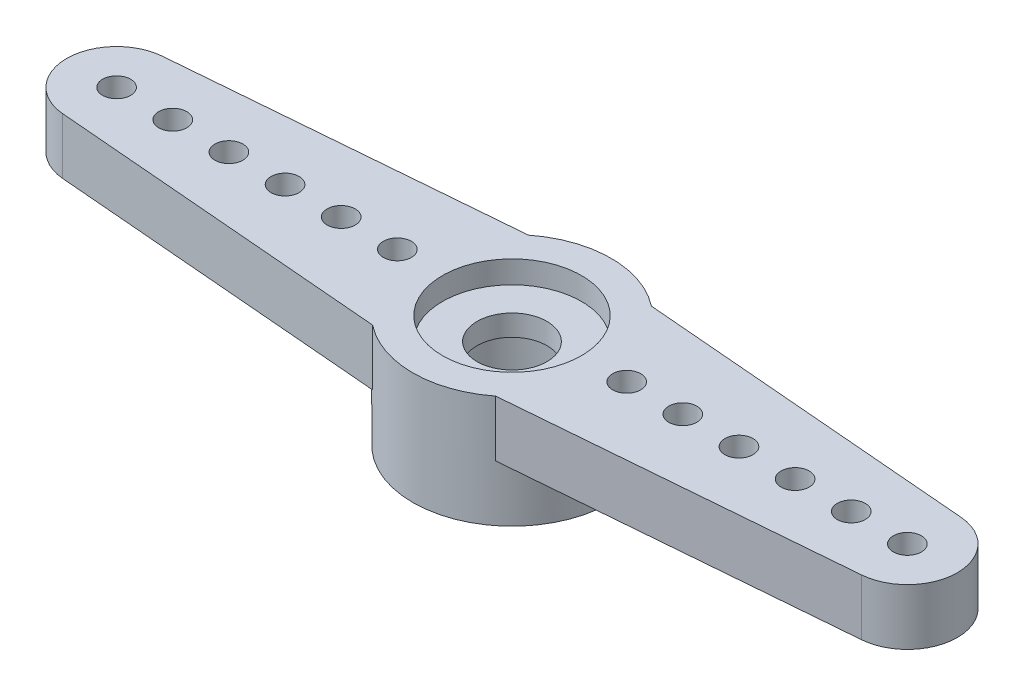
ISO-10303-21;
HEADER;
FILE_DESCRIPTION(('STEP AP214'),'2;1');
FILE_NAME('part.step','',(''),(''),'','','');
FILE_SCHEMA(('AUTOMOTIVE_DESIGN { 1 0 10303 214 1 1 1 1 }'));
ENDSEC;
DATA;
#1=APPLICATION_CONTEXT('core data for automotive mechanical design processes');
#2=APPLICATION_PROTOCOL_DEFINITION('international standard','automotive_design',2000,#1);
#3=PRODUCT_CONTEXT('',#1,'mechanical');
#4=PRODUCT('Part','Part','',(#3));
#5=PRODUCT_RELATED_PRODUCT_CATEGORY('part','',(#4));
#6=PRODUCT_DEFINITION_FORMATION('','',#4);
#7=PRODUCT_DEFINITION_CONTEXT('part definition',#1,'design');
#8=PRODUCT_DEFINITION('design','',#6,#7);
#9=PRODUCT_DEFINITION_SHAPE('','',#8);
#10=(LENGTH_UNIT() NAMED_UNIT(*) SI_UNIT(.MILLI.,.METRE.));
#11=(NAMED_UNIT(*) PLANE_ANGLE_UNIT() SI_UNIT($,.RADIAN.));
#12=(NAMED_UNIT(*) SI_UNIT($,.STERADIAN.) SOLID_ANGLE_UNIT());
#13=UNCERTAINTY_MEASURE_WITH_UNIT(LENGTH_MEASURE(1.E-05),#10,'distance_accuracy_value','');
#14=(GEOMETRIC_REPRESENTATION_CONTEXT(3) GLOBAL_UNCERTAINTY_ASSIGNED_CONTEXT((#13)) GLOBAL_UNIT_ASSIGNED_CONTEXT((#10,
#11,#12)) REPRESENTATION_CONTEXT('',''));
#15=CARTESIAN_POINT('',(0.,0.,0.));
#16=DIRECTION('',(0.,0.,1.));
#17=DIRECTION('',(1.,0.,0.));
#18=AXIS2_PLACEMENT_3D('',#15,#16,#17);
#19=CARTESIAN_POINT('',(0.,55.,0.));
#20=DIRECTION('',(0.,1.,0.));
#21=DIRECTION('',(0.,0.,1.));
#22=AXIS2_PLACEMENT_3D('',#19,#20,#21);
#23=CYLINDRICAL_SURFACE('',#22,3.535);
#24=CARTESIAN_POINT('',(0.,-2.,0.));
#25=DIRECTION('',(0.,1.,0.));
#26=DIRECTION('',(0.,0.,1.));
#27=AXIS2_PLACEMENT_3D('',#24,#25,#26);
#28=CIRCLE('',#27,3.535);
#29=CARTESIAN_POINT('',(0.,-2.,3.535));
#30=VERTEX_POINT('',#29);
#31=EDGE_CURVE('E241',#30,#30,#28,.T.);
#32=ORIENTED_EDGE('',*,*,#31,.T.);
#33=EDGE_LOOP('',(#32));
#34=FACE_BOUND('',#33,.T.);
#35=DIRECTION('',(0.,-1.,0.));
#36=VECTOR('',#35,1.);
#37=CARTESIAN_POINT('',(-2.18988584177349,15.9538300204828,-2.775));
#38=LINE('',#37,#36);
#39=CARTESIAN_POINT('',(-2.18988584177349,2.,-2.775));
#40=VERTEX_POINT('',#39);
#41=CARTESIAN_POINT('',(-2.18988584177349,0.,-2.775));
#42=VERTEX_POINT('',#41);
#43=EDGE_CURVE('E105',#40,#42,#38,.T.);
#44=ORIENTED_EDGE('',*,*,#43,.F.);
#45=CARTESIAN_POINT('',(0.,2.,0.));
#46=DIRECTION('',(0.,1.,0.));
#47=DIRECTION('',(0.,0.,1.));
#48=AXIS2_PLACEMENT_3D('',#45,#46,#47);
#49=CIRCLE('',#48,3.535);
#50=CARTESIAN_POINT('',(2.18988584177349,2.,-2.775));
#51=VERTEX_POINT('',#50);
#52=EDGE_CURVE('E239',#51,#40,#49,.T.);
#53=ORIENTED_EDGE('',*,*,#52,.F.);
#54=DIRECTION('',(0.,-1.,0.));
#55=VECTOR('',#54,1.);
#56=CARTESIAN_POINT('',(2.18988584177349,15.9538300204828,-2.775));
#57=LINE('',#56,#55);
#58=CARTESIAN_POINT('',(2.18988584177349,0.,-2.775));
#59=VERTEX_POINT('',#58);
#60=EDGE_CURVE('E183',#51,#59,#57,.T.);
#61=ORIENTED_EDGE('',*,*,#60,.T.);
#62=CARTESIAN_POINT('',(0.,0.,0.));
#63=DIRECTION('',(0.,1.,0.));
#64=DIRECTION('',(0.,0.,1.));
#65=AXIS2_PLACEMENT_3D('',#62,#63,#64);
#66=CIRCLE('',#65,3.535);
#67=CARTESIAN_POINT('',(2.18988584177349,0.,2.775));
#68=VERTEX_POINT('',#67);
#69=EDGE_CURVE('E214',#68,#59,#66,.T.);
#70=ORIENTED_EDGE('',*,*,#69,.F.);
#71=DIRECTION('',(0.,-1.,0.));
#72=VECTOR('',#71,1.);
#73=CARTESIAN_POINT('',(2.18988584177349,15.9538300204828,2.775));
#74=LINE('',#73,#72);
#75=CARTESIAN_POINT('',(2.18988584177349,2.,2.775));
#76=VERTEX_POINT('',#75);
#77=EDGE_CURVE('E192',#76,#68,#74,.T.);
#78=ORIENTED_EDGE('',*,*,#77,.F.);
#79=CARTESIAN_POINT('',(-2.18988584177349,2.,2.775));
#80=VERTEX_POINT('',#79);
#81=EDGE_CURVE('E211',#80,#76,#49,.T.);
#82=ORIENTED_EDGE('',*,*,#81,.F.);
#83=DIRECTION('',(0.,-1.,0.));
#84=VECTOR('',#83,1.);
#85=CARTESIAN_POINT('',(-2.18988584177349,15.9538300204828,2.775));
#86=LINE('',#85,#84);
#87=CARTESIAN_POINT('',(-2.18988584177349,0.,2.775));
#88=VERTEX_POINT('',#87);
#89=EDGE_CURVE('E51',#80,#88,#86,.T.);
#90=ORIENTED_EDGE('',*,*,#89,.T.);
#91=CARTESIAN_POINT('',(0.,0.,0.));
#92=DIRECTION('',(0.,-1.,0.));
#93=DIRECTION('',(0.,0.,1.));
#94=AXIS2_PLACEMENT_3D('',#91,#92,#93);
#95=CIRCLE('',#94,3.535);
#96=EDGE_CURVE('E102',#88,#42,#95,.T.);
#97=ORIENTED_EDGE('',*,*,#96,.T.);
#98=EDGE_LOOP('',(#44,#53,#61,#70,#78,#82,#90,#97));
#99=FACE_BOUND('',#98,.T.);
#100=ADVANCED_FACE('F36',(#34,#99),#23,.T.);
#101=CARTESIAN_POINT('',(3.535,2.,0.));
#102=DIRECTION('',(0.,-1.,0.));
#103=DIRECTION('',(0.,0.,-1.));
#104=AXIS2_PLACEMENT_3D('',#101,#102,#103);
#105=PLANE('',#104);
#106=CARTESIAN_POINT('',(4.085,2.,0.));
#107=DIRECTION('',(0.,-1.,0.));
#108=DIRECTION('',(0.,0.,-1.));
#109=AXIS2_PLACEMENT_3D('',#106,#107,#108);
#110=CIRCLE('',#109,0.500000000000001);
#111=CARTESIAN_POINT('',(4.085,2.,-0.499999999999931));
#112=VERTEX_POINT('',#111);
#113=EDGE_CURVE('E208',#112,#112,#110,.T.);
#114=ORIENTED_EDGE('',*,*,#113,.T.);
#115=EDGE_LOOP('',(#114));
#116=FACE_BOUND('',#115,.T.);
#117=DIRECTION('',(-0.996562375684888,0.,0.0828458289190973));
#118=VECTOR('',#117,1.);
#119=CARTESIAN_POINT('',(0.244137006312476,2.,2.93675322195096));
#120=LINE('',#119,#118);
#121=CARTESIAN_POINT('',(14.232465575476,2.,1.7738810287191));
#122=VERTEX_POINT('',#121);
#123=EDGE_CURVE('E205',#122,#76,#120,.T.);
#124=ORIENTED_EDGE('',*,*,#123,.F.);
#125=CARTESIAN_POINT('',(14.085,2.,0.));
#126=DIRECTION('',(0.,-1.,0.));
#127=DIRECTION('',(0.,0.,-1.));
#128=AXIS2_PLACEMENT_3D('',#125,#126,#127);
#129=CIRCLE('',#128,1.78);
#130=CARTESIAN_POINT('',(14.232465575476,2.,-1.7738810287191));
#131=VERTEX_POINT('',#130);
#132=EDGE_CURVE('E59',#131,#122,#129,.T.);
#133=ORIENTED_EDGE('',*,*,#132,.F.);
#134=DIRECTION('',(-0.996562375684888,0.,-0.0828458289190973));
#135=VECTOR('',#134,1.);
#136=CARTESIAN_POINT('',(0.244137006312476,2.,-2.93675322195096));
#137=LINE('',#136,#135);
#138=EDGE_CURVE('E177',#131,#51,#137,.T.);
#139=ORIENTED_EDGE('',*,*,#138,.T.);
#140=ORIENTED_EDGE('',*,*,#52,.T.);
#141=DIRECTION('',(0.996562375684888,0.,-0.0828458289190973));
#142=VECTOR('',#141,1.);
#143=CARTESIAN_POINT('',(-0.244137006312476,2.,-2.93675322195096));
#144=LINE('',#143,#142);
#145=CARTESIAN_POINT('',(-14.232465575476,2.,-1.7738810287191));
#146=VERTEX_POINT('',#145);
#147=EDGE_CURVE('E119',#146,#40,#144,.T.);
#148=ORIENTED_EDGE('',*,*,#147,.F.);
#149=CARTESIAN_POINT('',(-14.085,2.,0.));
#150=DIRECTION('',(0.,-1.,0.));
#151=DIRECTION('',(0.,0.,-1.));
#152=AXIS2_PLACEMENT_3D('',#149,#150,#151);
#153=CIRCLE('',#152,1.78);
#154=CARTESIAN_POINT('',(-14.232465575476,2.,1.7738810287191));
#155=VERTEX_POINT('',#154);
#156=EDGE_CURVE('E133',#146,#155,#153,.F.);
#157=ORIENTED_EDGE('',*,*,#156,.T.);
#158=DIRECTION('',(0.996562375684888,0.,0.0828458289190973));
#159=VECTOR('',#158,1.);
#160=CARTESIAN_POINT('',(-0.244137006312476,2.,2.93675322195096));
#161=LINE('',#160,#159);
#162=EDGE_CURVE('E131',#155,#80,#161,.T.);
#163=ORIENTED_EDGE('',*,*,#162,.T.);
#164=ORIENTED_EDGE('',*,*,#81,.T.);
#165=EDGE_LOOP('',(#124,#133,#139,#140,#148,#157,#163,#164));
#166=FACE_BOUND('',#165,.T.);
#167=CARTESIAN_POINT('',(14.085,2.,0.));
#168=DIRECTION('',(0.,-1.,0.));
#169=DIRECTION('',(0.,0.,-1.));
#170=AXIS2_PLACEMENT_3D('',#167,#168,#169);
#171=CIRCLE('',#170,0.500000000000001);
#172=CARTESIAN_POINT('',(14.085,2.,-0.500000000000001));
#173=VERTEX_POINT('',#172);
#174=EDGE_CURVE('E201',#173,#173,#171,.T.);
#175=ORIENTED_EDGE('',*,*,#174,.T.);
#176=EDGE_LOOP('',(#175));
#177=FACE_BOUND('',#176,.T.);
#178=CARTESIAN_POINT('',(12.085,2.,0.));
#179=DIRECTION('',(0.,-1.,0.));
#180=DIRECTION('',(0.,0.,-1.));
#181=AXIS2_PLACEMENT_3D('',#178,#179,#180);
#182=CIRCLE('',#181,0.500000000000001);
#183=CARTESIAN_POINT('',(12.085,2.,-0.499999999999987));
#184=VERTEX_POINT('',#183);
#185=EDGE_CURVE('E198',#184,#184,#182,.T.);
#186=ORIENTED_EDGE('',*,*,#185,.T.);
#187=EDGE_LOOP('',(#186));
#188=FACE_BOUND('',#187,.T.);
#189=CARTESIAN_POINT('',(10.085,2.,0.));
#190=DIRECTION('',(0.,-1.,0.));
#191=DIRECTION('',(0.,0.,-1.));
#192=AXIS2_PLACEMENT_3D('',#189,#190,#191);
#193=CIRCLE('',#192,0.500000000000001);
#194=CARTESIAN_POINT('',(10.085,2.,-0.499999999999973));
#195=VERTEX_POINT('',#194);
#196=EDGE_CURVE('E195',#195,#195,#193,.T.);
#197=ORIENTED_EDGE('',*,*,#196,.T.);
#198=EDGE_LOOP('',(#197));
#199=FACE_BOUND('',#198,.T.);
#200=CARTESIAN_POINT('',(8.085,2.,0.));
#201=DIRECTION('',(0.,-1.,0.));
#202=DIRECTION('',(0.,0.,-1.));
#203=AXIS2_PLACEMENT_3D('',#200,#201,#202);
#204=CIRCLE('',#203,0.500000000000001);
#205=CARTESIAN_POINT('',(8.085,2.,-0.499999999999959));
#206=VERTEX_POINT('',#205);
#207=EDGE_CURVE('E191',#206,#206,#204,.T.);
#208=ORIENTED_EDGE('',*,*,#207,.T.);
#209=EDGE_LOOP('',(#208));
#210=FACE_BOUND('',#209,.T.);
#211=CARTESIAN_POINT('',(6.085,2.,0.));
#212=DIRECTION('',(0.,-1.,0.));
#213=DIRECTION('',(0.,0.,-1.));
#214=AXIS2_PLACEMENT_3D('',#211,#212,#213);
#215=CIRCLE('',#214,0.500000000000001);
#216=CARTESIAN_POINT('',(6.085,2.,-0.499999999999945));
#217=VERTEX_POINT('',#216);
#218=EDGE_CURVE('E188',#217,#217,#215,.T.);
#219=ORIENTED_EDGE('',*,*,#218,.T.);
#220=EDGE_LOOP('',(#219));
#221=FACE_BOUND('',#220,.T.);
#222=CARTESIAN_POINT('',(0.,2.,0.));
#223=DIRECTION('',(0.,1.,0.));
#224=DIRECTION('',(0.,0.,1.));
#225=AXIS2_PLACEMENT_3D('',#222,#223,#224);
#226=CIRCLE('',#225,2.475);
#227=CARTESIAN_POINT('',(0.,2.,2.475));
#228=VERTEX_POINT('',#227);
#229=EDGE_CURVE('E11',#228,#228,#226,.T.);
#230=ORIENTED_EDGE('',*,*,#229,.F.);
#231=EDGE_LOOP('',(#230));
#232=FACE_BOUND('',#231,.T.);
#233=CARTESIAN_POINT('',(-4.085,2.,0.));
#234=DIRECTION('',(0.,-1.,0.));
#235=DIRECTION('',(0.,0.,-1.));
#236=AXIS2_PLACEMENT_3D('',#233,#234,#235);
#237=CIRCLE('',#236,0.500000000000001);
#238=CARTESIAN_POINT('',(-4.085,2.,-0.499999999999931));
#239=VERTEX_POINT('',#238);
#240=EDGE_CURVE('E151',#239,#239,#237,.F.);
#241=ORIENTED_EDGE('',*,*,#240,.F.);
#242=EDGE_LOOP('',(#241));
#243=FACE_BOUND('',#242,.T.);
#244=CARTESIAN_POINT('',(-6.085,2.,0.));
#245=DIRECTION('',(0.,-1.,0.));
#246=DIRECTION('',(0.,0.,-1.));
#247=AXIS2_PLACEMENT_3D('',#244,#245,#246);
#248=CIRCLE('',#247,0.500000000000001);
#249=CARTESIAN_POINT('',(-6.085,2.,-0.499999999999945));
#250=VERTEX_POINT('',#249);
#251=EDGE_CURVE('E148',#250,#250,#248,.F.);
#252=ORIENTED_EDGE('',*,*,#251,.F.);
#253=EDGE_LOOP('',(#252));
#254=FACE_BOUND('',#253,.T.);
#255=CARTESIAN_POINT('',(-8.085,2.,0.));
#256=DIRECTION('',(0.,-1.,0.));
#257=DIRECTION('',(0.,0.,-1.));
#258=AXIS2_PLACEMENT_3D('',#255,#256,#257);
#259=CIRCLE('',#258,0.500000000000001);
#260=CARTESIAN_POINT('',(-8.085,2.,-0.499999999999959));
#261=VERTEX_POINT('',#260);
#262=EDGE_CURVE('E145',#261,#261,#259,.F.);
#263=ORIENTED_EDGE('',*,*,#262,.F.);
#264=EDGE_LOOP('',(#263));
#265=FACE_BOUND('',#264,.T.);
#266=CARTESIAN_POINT('',(-10.085,2.,0.));
#267=DIRECTION('',(0.,-1.,0.));
#268=DIRECTION('',(0.,0.,-1.));
#269=AXIS2_PLACEMENT_3D('',#266,#267,#268);
#270=CIRCLE('',#269,0.500000000000001);
#271=CARTESIAN_POINT('',(-10.085,2.,-0.499999999999973));
#272=VERTEX_POINT('',#271);
#273=EDGE_CURVE('E142',#272,#272,#270,.F.);
#274=ORIENTED_EDGE('',*,*,#273,.F.);
#275=EDGE_LOOP('',(#274));
#276=FACE_BOUND('',#275,.T.);
#277=CARTESIAN_POINT('',(-12.085,2.,0.));
#278=DIRECTION('',(0.,-1.,0.));
#279=DIRECTION('',(0.,0.,-1.));
#280=AXIS2_PLACEMENT_3D('',#277,#278,#279);
#281=CIRCLE('',#280,0.500000000000001);
#282=CARTESIAN_POINT('',(-12.085,2.,-0.499999999999987));
#283=VERTEX_POINT('',#282);
#284=EDGE_CURVE('E139',#283,#283,#281,.F.);
#285=ORIENTED_EDGE('',*,*,#284,.F.);
#286=EDGE_LOOP('',(#285));
#287=FACE_BOUND('',#286,.T.);
#288=CARTESIAN_POINT('',(-14.085,2.,0.));
#289=DIRECTION('',(0.,-1.,0.));
#290=DIRECTION('',(0.,0.,-1.));
#291=AXIS2_PLACEMENT_3D('',#288,#289,#290);
#292=CIRCLE('',#291,0.500000000000001);
#293=CARTESIAN_POINT('',(-14.085,2.,-0.500000000000001));
#294=VERTEX_POINT('',#293);
#295=EDGE_CURVE('E136',#294,#294,#292,.F.);
#296=ORIENTED_EDGE('',*,*,#295,.F.);
#297=EDGE_LOOP('',(#296));
#298=FACE_BOUND('',#297,.T.);
#299=ADVANCED_FACE('F38',(#116,#166,#177,#188,#199,#210,#221,#232,#243,#254,#265,#276,#287,
#298),#105,.F.);
#300=CARTESIAN_POINT('',(0.,55.,0.));
#301=DIRECTION('',(0.,1.,0.));
#302=DIRECTION('',(0.,0.,1.));
#303=AXIS2_PLACEMENT_3D('',#300,#301,#302);
#304=CYLINDRICAL_SURFACE('',#303,2.475);
#305=CARTESIAN_POINT('',(0.,1.2,0.));
#306=DIRECTION('',(0.,1.,0.));
#307=DIRECTION('',(0.,0.,1.));
#308=AXIS2_PLACEMENT_3D('',#305,#306,#307);
#309=CIRCLE('',#308,2.475);
#310=CARTESIAN_POINT('',(0.,1.2,2.475));
#311=VERTEX_POINT('',#310);
#312=EDGE_CURVE('E44',#311,#311,#309,.T.);
#313=ORIENTED_EDGE('',*,*,#312,.F.);
#314=EDGE_LOOP('',(#313));
#315=FACE_BOUND('',#314,.T.);
#316=ORIENTED_EDGE('',*,*,#229,.T.);
#317=EDGE_LOOP('',(#316));
#318=FACE_BOUND('',#317,.T.);
#319=ADVANCED_FACE('F260',(#315,#318),#304,.F.);
#320=CARTESIAN_POINT('',(2.475,1.2,0.));
#321=DIRECTION('',(0.,-1.,0.));
#322=DIRECTION('',(0.,0.,-1.));
#323=AXIS2_PLACEMENT_3D('',#320,#321,#322);
#324=PLANE('',#323);
#325=CARTESIAN_POINT('',(0.,1.2,0.));
#326=DIRECTION('',(0.,1.,0.));
#327=DIRECTION('',(0.,0.,1.));
#328=AXIS2_PLACEMENT_3D('',#325,#326,#327);
#329=CIRCLE('',#328,1.245);
#330=CARTESIAN_POINT('',(0.,1.2,1.245));
#331=VERTEX_POINT('',#330);
#332=EDGE_CURVE('E253',#331,#331,#329,.T.);
#333=ORIENTED_EDGE('',*,*,#332,.F.);
#334=EDGE_LOOP('',(#333));
#335=FACE_BOUND('',#334,.T.);
#336=ORIENTED_EDGE('',*,*,#312,.T.);
#337=EDGE_LOOP('',(#336));
#338=FACE_BOUND('',#337,.T.);
#339=ADVANCED_FACE('F258',(#335,#338),#324,.F.);
#340=CARTESIAN_POINT('',(0.,55.,0.));
#341=DIRECTION('',(0.,1.,0.));
#342=DIRECTION('',(0.,0.,1.));
#343=AXIS2_PLACEMENT_3D('',#340,#341,#342);
#344=CYLINDRICAL_SURFACE('',#343,1.245);
#345=CARTESIAN_POINT('',(0.,0.449999999999999,0.));
#346=DIRECTION('',(0.,1.,0.));
#347=DIRECTION('',(0.,0.,1.));
#348=AXIS2_PLACEMENT_3D('',#345,#346,#347);
#349=CIRCLE('',#348,1.245);
#350=CARTESIAN_POINT('',(0.,0.449999999999999,1.245));
#351=VERTEX_POINT('',#350);
#352=EDGE_CURVE('E250',#351,#351,#349,.T.);
#353=ORIENTED_EDGE('',*,*,#352,.F.);
#354=EDGE_LOOP('',(#353));
#355=FACE_BOUND('',#354,.T.);
#356=ORIENTED_EDGE('',*,*,#332,.T.);
#357=EDGE_LOOP('',(#356));
#358=FACE_BOUND('',#357,.T.);
#359=ADVANCED_FACE('F316',(#355,#358),#344,.F.);
#360=CARTESIAN_POINT('',(1.245,0.45,0.));
#361=DIRECTION('',(0.,1.,0.));
#362=DIRECTION('',(0.,0.,1.));
#363=AXIS2_PLACEMENT_3D('',#360,#361,#362);
#364=PLANE('',#363);
#365=CARTESIAN_POINT('',(0.,0.449999999999999,0.));
#366=DIRECTION('',(0.,1.,0.));
#367=DIRECTION('',(0.,0.,1.));
#368=AXIS2_PLACEMENT_3D('',#365,#366,#367);
#369=CIRCLE('',#368,2.375);
#370=CARTESIAN_POINT('',(0.,0.449999999999999,2.375));
#371=VERTEX_POINT('',#370);
#372=EDGE_CURVE('E247',#371,#371,#369,.T.);
#373=ORIENTED_EDGE('',*,*,#372,.F.);
#374=EDGE_LOOP('',(#373));
#375=FACE_BOUND('',#374,.T.);
#376=ORIENTED_EDGE('',*,*,#352,.T.);
#377=EDGE_LOOP('',(#376));
#378=FACE_BOUND('',#377,.T.);
#379=ADVANCED_FACE('F312',(#375,#378),#364,.F.);
#380=CARTESIAN_POINT('',(0.,55.,0.));
#381=DIRECTION('',(0.,1.,0.));
#382=DIRECTION('',(0.,0.,1.));
#383=AXIS2_PLACEMENT_3D('',#380,#381,#382);
#384=CYLINDRICAL_SURFACE('',#383,2.375);
#385=CARTESIAN_POINT('',(0.,-2.,0.));
#386=DIRECTION('',(0.,1.,0.));
#387=DIRECTION('',(0.,0.,1.));
#388=AXIS2_PLACEMENT_3D('',#385,#386,#387);
#389=CIRCLE('',#388,2.375);
#390=CARTESIAN_POINT('',(0.,-2.,2.375));
#391=VERTEX_POINT('',#390);
#392=EDGE_CURVE('E244',#391,#391,#389,.T.);
#393=ORIENTED_EDGE('',*,*,#392,.F.);
#394=EDGE_LOOP('',(#393));
#395=FACE_BOUND('',#394,.T.);
#396=ORIENTED_EDGE('',*,*,#372,.T.);
#397=EDGE_LOOP('',(#396));
#398=FACE_BOUND('',#397,.T.);
#399=ADVANCED_FACE('F308',(#395,#398),#384,.F.);
#400=CARTESIAN_POINT('',(2.375,-2.,0.));
#401=DIRECTION('',(0.,1.,0.));
#402=DIRECTION('',(0.,0.,1.));
#403=AXIS2_PLACEMENT_3D('',#400,#401,#402);
#404=PLANE('',#403);
#405=ORIENTED_EDGE('',*,*,#31,.F.);
#406=EDGE_LOOP('',(#405));
#407=FACE_BOUND('',#406,.T.);
#408=ORIENTED_EDGE('',*,*,#392,.T.);
#409=EDGE_LOOP('',(#408));
#410=FACE_BOUND('',#409,.T.);
#411=ADVANCED_FACE('F305',(#407,#410),#404,.F.);
#412=CARTESIAN_POINT('',(4.085,15.9538300204828,0.));
#413=DIRECTION('',(0.,-1.,0.));
#414=DIRECTION('',(0.,0.,-1.));
#415=AXIS2_PLACEMENT_3D('',#412,#413,#414);
#416=CYLINDRICAL_SURFACE('',#415,0.500000000000001);
#417=ORIENTED_EDGE('',*,*,#113,.F.);
#418=EDGE_LOOP('',(#417));
#419=FACE_BOUND('',#418,.T.);
#420=CARTESIAN_POINT('',(4.085,0.,0.));
#421=DIRECTION('',(0.,1.,0.));
#422=DIRECTION('',(0.,0.,1.));
#423=AXIS2_PLACEMENT_3D('',#420,#421,#422);
#424=CIRCLE('',#423,0.500000000000001);
#425=CARTESIAN_POINT('',(4.085,0.,0.500000000000071));
#426=VERTEX_POINT('',#425);
#427=EDGE_CURVE('E179',#426,#426,#424,.T.);
#428=ORIENTED_EDGE('',*,*,#427,.F.);
#429=EDGE_LOOP('',(#428));
#430=FACE_BOUND('',#429,.T.);
#431=ADVANCED_FACE('F303',(#419,#430),#416,.F.);
#432=CARTESIAN_POINT('',(0.244137006312476,15.9538300204828,2.93675322195096));
#433=DIRECTION('',(-0.0828458289190973,0.,-0.996562375684888));
#434=DIRECTION('',(-0.996562375684888,0.,0.0828458289190973));
#435=AXIS2_PLACEMENT_3D('',#432,#433,#434);
#436=PLANE('',#435);
#437=DIRECTION('',(0.,-1.,0.));
#438=VECTOR('',#437,1.);
#439=CARTESIAN_POINT('',(14.232465575476,15.9538300204828,1.7738810287191));
#440=LINE('',#439,#438);
#441=CARTESIAN_POINT('',(14.232465575476,0.,1.7738810287191));
#442=VERTEX_POINT('',#441);
#443=EDGE_CURVE('E236',#122,#442,#440,.T.);
#444=ORIENTED_EDGE('',*,*,#443,.F.);
#445=ORIENTED_EDGE('',*,*,#123,.T.);
#446=ORIENTED_EDGE('',*,*,#77,.T.);
#447=DIRECTION('',(0.996562375684888,0.,-0.0828458289190973));
#448=VECTOR('',#447,1.);
#449=CARTESIAN_POINT('',(0.244137006312476,0.,2.93675322195096));
#450=LINE('',#449,#448);
#451=EDGE_CURVE('E216',#68,#442,#450,.T.);
#452=ORIENTED_EDGE('',*,*,#451,.T.);
#453=EDGE_LOOP('',(#444,#445,#446,#452));
#454=FACE_BOUND('',#453,.T.);
#455=ADVANCED_FACE('F352',(#454),#436,.F.);
#456=CARTESIAN_POINT('',(14.085,15.9538300204828,0.));
#457=DIRECTION('',(0.,-1.,0.));
#458=DIRECTION('',(0.,0.,-1.));
#459=AXIS2_PLACEMENT_3D('',#456,#457,#458);
#460=CYLINDRICAL_SURFACE('',#459,1.78);
#461=ORIENTED_EDGE('',*,*,#132,.T.);
#462=ORIENTED_EDGE('',*,*,#443,.T.);
#463=CARTESIAN_POINT('',(14.085,0.,0.));
#464=DIRECTION('',(0.,1.,0.));
#465=DIRECTION('',(0.,0.,1.));
#466=AXIS2_PLACEMENT_3D('',#463,#464,#465);
#467=CIRCLE('',#466,1.78);
#468=CARTESIAN_POINT('',(14.232465575476,0.,-1.7738810287191));
#469=VERTEX_POINT('',#468);
#470=EDGE_CURVE('E219',#442,#469,#467,.T.);
#471=ORIENTED_EDGE('',*,*,#470,.T.);
#472=DIRECTION('',(0.,-1.,0.));
#473=VECTOR('',#472,1.);
#474=CARTESIAN_POINT('',(14.232465575476,15.9538300204828,-1.7738810287191));
#475=LINE('',#474,#473);
#476=EDGE_CURVE('E180',#131,#469,#475,.T.);
#477=ORIENTED_EDGE('',*,*,#476,.F.);
#478=EDGE_LOOP('',(#461,#462,#471,#477));
#479=FACE_BOUND('',#478,.T.);
#480=ADVANCED_FACE('F360',(#479),#460,.T.);
#481=CARTESIAN_POINT('',(14.085,15.9538300204828,0.));
#482=DIRECTION('',(0.,-1.,0.));
#483=DIRECTION('',(0.,0.,-1.));
#484=AXIS2_PLACEMENT_3D('',#481,#482,#483);
#485=CYLINDRICAL_SURFACE('',#484,0.500000000000001);
#486=CARTESIAN_POINT('',(14.085,0.,0.));
#487=DIRECTION('',(0.,1.,0.));
#488=DIRECTION('',(0.,0.,1.));
#489=AXIS2_PLACEMENT_3D('',#486,#487,#488);
#490=CIRCLE('',#489,0.500000000000001);
#491=CARTESIAN_POINT('',(14.085,0.,0.500000000000001));
#492=VERTEX_POINT('',#491);
#493=EDGE_CURVE('E221',#492,#492,#490,.T.);
#494=ORIENTED_EDGE('',*,*,#493,.F.);
#495=EDGE_LOOP('',(#494));
#496=FACE_BOUND('',#495,.T.);
#497=ORIENTED_EDGE('',*,*,#174,.F.);
#498=EDGE_LOOP('',(#497));
#499=FACE_BOUND('',#498,.T.);
#500=ADVANCED_FACE('F367',(#496,#499),#485,.F.);
#501=CARTESIAN_POINT('',(12.085,15.9538300204828,0.));
#502=DIRECTION('',(0.,-1.,0.));
#503=DIRECTION('',(0.,0.,-1.));
#504=AXIS2_PLACEMENT_3D('',#501,#502,#503);
#505=CYLINDRICAL_SURFACE('',#504,0.500000000000001);
#506=CARTESIAN_POINT('',(12.085,0.,0.));
#507=DIRECTION('',(0.,1.,0.));
#508=DIRECTION('',(0.,0.,1.));
#509=AXIS2_PLACEMENT_3D('',#506,#507,#508);
#510=CIRCLE('',#509,0.500000000000001);
#511=CARTESIAN_POINT('',(12.085,0.,0.500000000000015));
#512=VERTEX_POINT('',#511);
#513=EDGE_CURVE('E224',#512,#512,#510,.T.);
#514=ORIENTED_EDGE('',*,*,#513,.F.);
#515=EDGE_LOOP('',(#514));
#516=FACE_BOUND('',#515,.T.);
#517=ORIENTED_EDGE('',*,*,#185,.F.);
#518=EDGE_LOOP('',(#517));
#519=FACE_BOUND('',#518,.T.);
#520=ADVANCED_FACE('F374',(#516,#519),#505,.F.);
#521=CARTESIAN_POINT('',(10.085,15.9538300204828,0.));
#522=DIRECTION('',(0.,-1.,0.));
#523=DIRECTION('',(0.,0.,-1.));
#524=AXIS2_PLACEMENT_3D('',#521,#522,#523);
#525=CYLINDRICAL_SURFACE('',#524,0.500000000000001);
#526=CARTESIAN_POINT('',(10.085,0.,0.));
#527=DIRECTION('',(0.,1.,0.));
#528=DIRECTION('',(0.,0.,1.));
#529=AXIS2_PLACEMENT_3D('',#526,#527,#528);
#530=CIRCLE('',#529,0.500000000000001);
#531=CARTESIAN_POINT('',(10.085,0.,0.500000000000029));
#532=VERTEX_POINT('',#531);
#533=EDGE_CURVE('E227',#532,#532,#530,.T.);
#534=ORIENTED_EDGE('',*,*,#533,.F.);
#535=EDGE_LOOP('',(#534));
#536=FACE_BOUND('',#535,.T.);
#537=ORIENTED_EDGE('',*,*,#196,.F.);
#538=EDGE_LOOP('',(#537));
#539=FACE_BOUND('',#538,.T.);
#540=ADVANCED_FACE('F382',(#536,#539),#525,.F.);
#541=CARTESIAN_POINT('',(8.085,15.9538300204828,0.));
#542=DIRECTION('',(0.,-1.,0.));
#543=DIRECTION('',(0.,0.,-1.));
#544=AXIS2_PLACEMENT_3D('',#541,#542,#543);
#545=CYLINDRICAL_SURFACE('',#544,0.500000000000001);
#546=CARTESIAN_POINT('',(8.085,0.,0.));
#547=DIRECTION('',(0.,1.,0.));
#548=DIRECTION('',(0.,0.,1.));
#549=AXIS2_PLACEMENT_3D('',#546,#547,#548);
#550=CIRCLE('',#549,0.500000000000001);
#551=CARTESIAN_POINT('',(8.085,0.,0.500000000000043));
#552=VERTEX_POINT('',#551);
#553=EDGE_CURVE('E230',#552,#552,#550,.T.);
#554=ORIENTED_EDGE('',*,*,#553,.F.);
#555=EDGE_LOOP('',(#554));
#556=FACE_BOUND('',#555,.T.);
#557=ORIENTED_EDGE('',*,*,#207,.F.);
#558=EDGE_LOOP('',(#557));
#559=FACE_BOUND('',#558,.T.);
#560=ADVANCED_FACE('F390',(#556,#559),#545,.F.);
#561=CARTESIAN_POINT('',(6.085,15.9538300204828,0.));
#562=DIRECTION('',(0.,-1.,0.));
#563=DIRECTION('',(0.,0.,-1.));
#564=AXIS2_PLACEMENT_3D('',#561,#562,#563);
#565=CYLINDRICAL_SURFACE('',#564,0.500000000000001);
#566=CARTESIAN_POINT('',(6.085,0.,0.));
#567=DIRECTION('',(0.,1.,0.));
#568=DIRECTION('',(0.,0.,1.));
#569=AXIS2_PLACEMENT_3D('',#566,#567,#568);
#570=CIRCLE('',#569,0.500000000000001);
#571=CARTESIAN_POINT('',(6.085,0.,0.500000000000057));
#572=VERTEX_POINT('',#571);
#573=EDGE_CURVE('E233',#572,#572,#570,.T.);
#574=ORIENTED_EDGE('',*,*,#573,.F.);
#575=EDGE_LOOP('',(#574));
#576=FACE_BOUND('',#575,.T.);
#577=ORIENTED_EDGE('',*,*,#218,.F.);
#578=EDGE_LOOP('',(#577));
#579=FACE_BOUND('',#578,.T.);
#580=ADVANCED_FACE('F398',(#576,#579),#565,.F.);
#581=CARTESIAN_POINT('',(0.,0.,0.));
#582=DIRECTION('',(0.,1.,0.));
#583=DIRECTION('',(0.,0.,1.));
#584=AXIS2_PLACEMENT_3D('',#581,#582,#583);
#585=PLANE('',#584);
#586=ORIENTED_EDGE('',*,*,#69,.T.);
#587=DIRECTION('',(0.996562375684888,0.,0.0828458289190973));
#588=VECTOR('',#587,1.);
#589=CARTESIAN_POINT('',(0.244137006312476,0.,-2.93675322195096));
#590=LINE('',#589,#588);
#591=EDGE_CURVE('E154',#59,#469,#590,.T.);
#592=ORIENTED_EDGE('',*,*,#591,.T.);
#593=ORIENTED_EDGE('',*,*,#470,.F.);
#594=ORIENTED_EDGE('',*,*,#451,.F.);
#595=EDGE_LOOP('',(#586,#592,#593,#594));
#596=FACE_BOUND('',#595,.T.);
#597=ORIENTED_EDGE('',*,*,#493,.T.);
#598=EDGE_LOOP('',(#597));
#599=FACE_BOUND('',#598,.T.);
#600=ORIENTED_EDGE('',*,*,#513,.T.);
#601=EDGE_LOOP('',(#600));
#602=FACE_BOUND('',#601,.T.);
#603=ORIENTED_EDGE('',*,*,#533,.T.);
#604=EDGE_LOOP('',(#603));
#605=FACE_BOUND('',#604,.T.);
#606=ORIENTED_EDGE('',*,*,#553,.T.);
#607=EDGE_LOOP('',(#606));
#608=FACE_BOUND('',#607,.T.);
#609=ORIENTED_EDGE('',*,*,#573,.T.);
#610=EDGE_LOOP('',(#609));
#611=FACE_BOUND('',#610,.T.);
#612=ORIENTED_EDGE('',*,*,#427,.T.);
#613=EDGE_LOOP('',(#612));
#614=FACE_BOUND('',#613,.T.);
#615=ADVANCED_FACE('F406',(#596,#599,#602,#605,#608,#611,#614),#585,.F.);
#616=CARTESIAN_POINT('',(0.244137006312476,15.9538300204828,-2.93675322195096));
#617=DIRECTION('',(0.0828458289190973,0.,-0.996562375684888));
#618=DIRECTION('',(-0.996562375684888,0.,-0.0828458289190973));
#619=AXIS2_PLACEMENT_3D('',#616,#617,#618);
#620=PLANE('',#619);
#621=ORIENTED_EDGE('',*,*,#138,.F.);
#622=ORIENTED_EDGE('',*,*,#476,.T.);
#623=ORIENTED_EDGE('',*,*,#591,.F.);
#624=ORIENTED_EDGE('',*,*,#60,.F.);
#625=EDGE_LOOP('',(#621,#622,#623,#624));
#626=FACE_BOUND('',#625,.T.);
#627=ADVANCED_FACE('F414',(#626),#620,.T.);
#628=CARTESIAN_POINT('',(0.,0.,0.));
#629=DIRECTION('',(0.,1.,0.));
#630=DIRECTION('',(0.,0.,1.));
#631=AXIS2_PLACEMENT_3D('',#628,#629,#630);
#632=PLANE('',#631);
#633=CARTESIAN_POINT('',(-4.085,0.,0.));
#634=DIRECTION('',(0.,-1.,0.));
#635=DIRECTION('',(0.,0.,1.));
#636=AXIS2_PLACEMENT_3D('',#633,#634,#635);
#637=CIRCLE('',#636,0.500000000000001);
#638=CARTESIAN_POINT('',(-4.085,0.,0.500000000000071));
#639=VERTEX_POINT('',#638);
#640=EDGE_CURVE('E155',#639,#639,#637,.T.);
#641=ORIENTED_EDGE('',*,*,#640,.F.);
#642=EDGE_LOOP('',(#641));
#643=FACE_BOUND('',#642,.T.);
#644=CARTESIAN_POINT('',(-14.085,0.,0.));
#645=DIRECTION('',(0.,-1.,0.));
#646=DIRECTION('',(0.,0.,1.));
#647=AXIS2_PLACEMENT_3D('',#644,#645,#646);
#648=CIRCLE('',#647,1.78);
#649=CARTESIAN_POINT('',(-14.232465575476,0.,1.7738810287191));
#650=VERTEX_POINT('',#649);
#651=CARTESIAN_POINT('',(-14.232465575476,0.,-1.7738810287191));
#652=VERTEX_POINT('',#651);
#653=EDGE_CURVE('E125',#650,#652,#648,.T.);
#654=ORIENTED_EDGE('',*,*,#653,.T.);
#655=DIRECTION('',(-0.996562375684888,0.,0.0828458289190973));
#656=VECTOR('',#655,1.);
#657=CARTESIAN_POINT('',(-0.244137006312476,0.,-2.93675322195096));
#658=LINE('',#657,#656);
#659=EDGE_CURVE('E117',#42,#652,#658,.T.);
#660=ORIENTED_EDGE('',*,*,#659,.F.);
#661=ORIENTED_EDGE('',*,*,#96,.F.);
#662=DIRECTION('',(-0.996562375684888,0.,-0.0828458289190973));
#663=VECTOR('',#662,1.);
#664=CARTESIAN_POINT('',(-0.244137006312476,0.,2.93675322195096));
#665=LINE('',#664,#663);
#666=EDGE_CURVE('E111',#88,#650,#665,.T.);
#667=ORIENTED_EDGE('',*,*,#666,.T.);
#668=EDGE_LOOP('',(#654,#660,#661,#667));
#669=FACE_BOUND('',#668,.T.);
#670=CARTESIAN_POINT('',(-14.085,0.,0.));
#671=DIRECTION('',(0.,-1.,0.));
#672=DIRECTION('',(0.,0.,1.));
#673=AXIS2_PLACEMENT_3D('',#670,#671,#672);
#674=CIRCLE('',#673,0.500000000000001);
#675=CARTESIAN_POINT('',(-14.085,0.,0.500000000000001));
#676=VERTEX_POINT('',#675);
#677=EDGE_CURVE('E170',#676,#676,#674,.T.);
#678=ORIENTED_EDGE('',*,*,#677,.F.);
#679=EDGE_LOOP('',(#678));
#680=FACE_BOUND('',#679,.T.);
#681=CARTESIAN_POINT('',(-12.085,0.,0.));
#682=DIRECTION('',(0.,-1.,0.));
#683=DIRECTION('',(0.,0.,1.));
#684=AXIS2_PLACEMENT_3D('',#681,#682,#683);
#685=CIRCLE('',#684,0.500000000000001);
#686=CARTESIAN_POINT('',(-12.085,0.,0.500000000000015));
#687=VERTEX_POINT('',#686);
#688=EDGE_CURVE('E167',#687,#687,#685,.T.);
#689=ORIENTED_EDGE('',*,*,#688,.F.);
#690=EDGE_LOOP('',(#689));
#691=FACE_BOUND('',#690,.T.);
#692=CARTESIAN_POINT('',(-10.085,0.,0.));
#693=DIRECTION('',(0.,-1.,0.));
#694=DIRECTION('',(0.,0.,1.));
#695=AXIS2_PLACEMENT_3D('',#692,#693,#694);
#696=CIRCLE('',#695,0.500000000000001);
#697=CARTESIAN_POINT('',(-10.085,0.,0.500000000000029));
#698=VERTEX_POINT('',#697);
#699=EDGE_CURVE('E164',#698,#698,#696,.T.);
#700=ORIENTED_EDGE('',*,*,#699,.F.);
#701=EDGE_LOOP('',(#700));
#702=FACE_BOUND('',#701,.T.);
#703=CARTESIAN_POINT('',(-8.085,0.,0.));
#704=DIRECTION('',(0.,-1.,0.));
#705=DIRECTION('',(0.,0.,1.));
#706=AXIS2_PLACEMENT_3D('',#703,#704,#705);
#707=CIRCLE('',#706,0.500000000000001);
#708=CARTESIAN_POINT('',(-8.085,0.,0.500000000000043));
#709=VERTEX_POINT('',#708);
#710=EDGE_CURVE('E161',#709,#709,#707,.T.);
#711=ORIENTED_EDGE('',*,*,#710,.F.);
#712=EDGE_LOOP('',(#711));
#713=FACE_BOUND('',#712,.T.);
#714=CARTESIAN_POINT('',(-6.085,0.,0.));
#715=DIRECTION('',(0.,-1.,0.));
#716=DIRECTION('',(0.,0.,1.));
#717=AXIS2_PLACEMENT_3D('',#714,#715,#716);
#718=CIRCLE('',#717,0.500000000000001);
#719=CARTESIAN_POINT('',(-6.085,0.,0.500000000000057));
#720=VERTEX_POINT('',#719);
#721=EDGE_CURVE('E158',#720,#720,#718,.T.);
#722=ORIENTED_EDGE('',*,*,#721,.F.);
#723=EDGE_LOOP('',(#722));
#724=FACE_BOUND('',#723,.T.);
#725=ADVANCED_FACE('F122',(#643,#669,#680,#691,#702,#713,#724),#632,.F.);
#726=CARTESIAN_POINT('',(-0.244137006312476,15.9538300204828,2.93675322195096));
#727=DIRECTION('',(-0.0828458289190973,0.,0.996562375684888));
#728=DIRECTION('',(0.996562375684888,0.,0.0828458289190973));
#729=AXIS2_PLACEMENT_3D('',#726,#727,#728);
#730=PLANE('',#729);
#731=ORIENTED_EDGE('',*,*,#162,.F.);
#732=DIRECTION('',(0.,-1.,0.));
#733=VECTOR('',#732,1.);
#734=CARTESIAN_POINT('',(-14.232465575476,15.9538300204828,1.7738810287191));
#735=LINE('',#734,#733);
#736=EDGE_CURVE('E134',#155,#650,#735,.T.);
#737=ORIENTED_EDGE('',*,*,#736,.T.);
#738=ORIENTED_EDGE('',*,*,#666,.F.);
#739=ORIENTED_EDGE('',*,*,#89,.F.);
#740=EDGE_LOOP('',(#731,#737,#738,#739));
#741=FACE_BOUND('',#740,.T.);
#742=ADVANCED_FACE('F293',(#741),#730,.T.);
#743=CARTESIAN_POINT('',(-14.085,15.9538300204828,0.));
#744=DIRECTION('',(0.,-1.,0.));
#745=DIRECTION('',(0.,0.,-1.));
#746=AXIS2_PLACEMENT_3D('',#743,#744,#745);
#747=CYLINDRICAL_SURFACE('',#746,1.78);
#748=ORIENTED_EDGE('',*,*,#156,.F.);
#749=DIRECTION('',(0.,-1.,0.));
#750=VECTOR('',#749,1.);
#751=CARTESIAN_POINT('',(-14.232465575476,15.9538300204828,-1.7738810287191));
#752=LINE('',#751,#750);
#753=EDGE_CURVE('E120',#146,#652,#752,.T.);
#754=ORIENTED_EDGE('',*,*,#753,.T.);
#755=ORIENTED_EDGE('',*,*,#653,.F.);
#756=ORIENTED_EDGE('',*,*,#736,.F.);
#757=EDGE_LOOP('',(#748,#754,#755,#756));
#758=FACE_BOUND('',#757,.T.);
#759=ADVANCED_FACE('F283',(#758),#747,.T.);
#760=CARTESIAN_POINT('',(-14.085,15.9538300204828,0.));
#761=DIRECTION('',(0.,-1.,0.));
#762=DIRECTION('',(0.,0.,-1.));
#763=AXIS2_PLACEMENT_3D('',#760,#761,#762);
#764=CYLINDRICAL_SURFACE('',#763,0.500000000000001);
#765=ORIENTED_EDGE('',*,*,#677,.T.);
#766=EDGE_LOOP('',(#765));
#767=FACE_BOUND('',#766,.T.);
#768=ORIENTED_EDGE('',*,*,#295,.T.);
#769=EDGE_LOOP('',(#768));
#770=FACE_BOUND('',#769,.T.);
#771=ADVANCED_FACE('F280',(#767,#770),#764,.F.);
#772=CARTESIAN_POINT('',(-12.085,15.9538300204828,0.));
#773=DIRECTION('',(0.,-1.,0.));
#774=DIRECTION('',(0.,0.,-1.));
#775=AXIS2_PLACEMENT_3D('',#772,#773,#774);
#776=CYLINDRICAL_SURFACE('',#775,0.500000000000001);
#777=ORIENTED_EDGE('',*,*,#688,.T.);
#778=EDGE_LOOP('',(#777));
#779=FACE_BOUND('',#778,.T.);
#780=ORIENTED_EDGE('',*,*,#284,.T.);
#781=EDGE_LOOP('',(#780));
#782=FACE_BOUND('',#781,.T.);
#783=ADVANCED_FACE('F282',(#779,#782),#776,.F.);
#784=CARTESIAN_POINT('',(-10.085,15.9538300204828,0.));
#785=DIRECTION('',(0.,-1.,0.));
#786=DIRECTION('',(0.,0.,-1.));
#787=AXIS2_PLACEMENT_3D('',#784,#785,#786);
#788=CYLINDRICAL_SURFACE('',#787,0.500000000000001);
#789=ORIENTED_EDGE('',*,*,#699,.T.);
#790=EDGE_LOOP('',(#789));
#791=FACE_BOUND('',#790,.T.);
#792=ORIENTED_EDGE('',*,*,#273,.T.);
#793=EDGE_LOOP('',(#792));
#794=FACE_BOUND('',#793,.T.);
#795=ADVANCED_FACE('F290',(#791,#794),#788,.F.);
#796=CARTESIAN_POINT('',(-8.085,15.9538300204828,0.));
#797=DIRECTION('',(0.,-1.,0.));
#798=DIRECTION('',(0.,0.,-1.));
#799=AXIS2_PLACEMENT_3D('',#796,#797,#798);
#800=CYLINDRICAL_SURFACE('',#799,0.500000000000001);
#801=ORIENTED_EDGE('',*,*,#710,.T.);
#802=EDGE_LOOP('',(#801));
#803=FACE_BOUND('',#802,.T.);
#804=ORIENTED_EDGE('',*,*,#262,.T.);
#805=EDGE_LOOP('',(#804));
#806=FACE_BOUND('',#805,.T.);
#807=ADVANCED_FACE('F461',(#803,#806),#800,.F.);
#808=CARTESIAN_POINT('',(-6.085,15.9538300204828,0.));
#809=DIRECTION('',(0.,-1.,0.));
#810=DIRECTION('',(0.,0.,-1.));
#811=AXIS2_PLACEMENT_3D('',#808,#809,#810);
#812=CYLINDRICAL_SURFACE('',#811,0.500000000000001);
#813=ORIENTED_EDGE('',*,*,#721,.T.);
#814=EDGE_LOOP('',(#813));
#815=FACE_BOUND('',#814,.T.);
#816=ORIENTED_EDGE('',*,*,#251,.T.);
#817=EDGE_LOOP('',(#816));
#818=FACE_BOUND('',#817,.T.);
#819=ADVANCED_FACE('F472',(#815,#818),#812,.F.);
#820=CARTESIAN_POINT('',(-4.085,15.9538300204828,0.));
#821=DIRECTION('',(0.,-1.,0.));
#822=DIRECTION('',(0.,0.,-1.));
#823=AXIS2_PLACEMENT_3D('',#820,#821,#822);
#824=CYLINDRICAL_SURFACE('',#823,0.500000000000001);
#825=ORIENTED_EDGE('',*,*,#640,.T.);
#826=EDGE_LOOP('',(#825));
#827=FACE_BOUND('',#826,.T.);
#828=ORIENTED_EDGE('',*,*,#240,.T.);
#829=EDGE_LOOP('',(#828));
#830=FACE_BOUND('',#829,.T.);
#831=ADVANCED_FACE('F483',(#827,#830),#824,.F.);
#832=CARTESIAN_POINT('',(-0.244137006312476,15.9538300204828,-2.93675322195096));
#833=DIRECTION('',(0.0828458289190973,0.,0.996562375684888));
#834=DIRECTION('',(0.996562375684888,0.,-0.0828458289190973));
#835=AXIS2_PLACEMENT_3D('',#832,#833,#834);
#836=PLANE('',#835);
#837=ORIENTED_EDGE('',*,*,#753,.F.);
#838=ORIENTED_EDGE('',*,*,#147,.T.);
#839=ORIENTED_EDGE('',*,*,#43,.T.);
#840=ORIENTED_EDGE('',*,*,#659,.T.);
#841=EDGE_LOOP('',(#837,#838,#839,#840));
#842=FACE_BOUND('',#841,.T.);
#843=ADVANCED_FACE('F116',(#842),#836,.F.);
#844=CLOSED_SHELL('',(#100,#299,#319,#339,#359,#379,#399,#411,#431,#455,#480,#500,#520,#540,
#560,#580,#615,#627,#725,#742,#759,#771,#783,#795,#807,#819,#831,#843));
#845=MANIFOLD_SOLID_BREP('B2',#844);
#846=ADVANCED_BREP_SHAPE_REPRESENTATION('',(#18,#845),#14);
#847=SHAPE_DEFINITION_REPRESENTATION(#9,#846);
ENDSEC;
END-ISO-10303-21;
